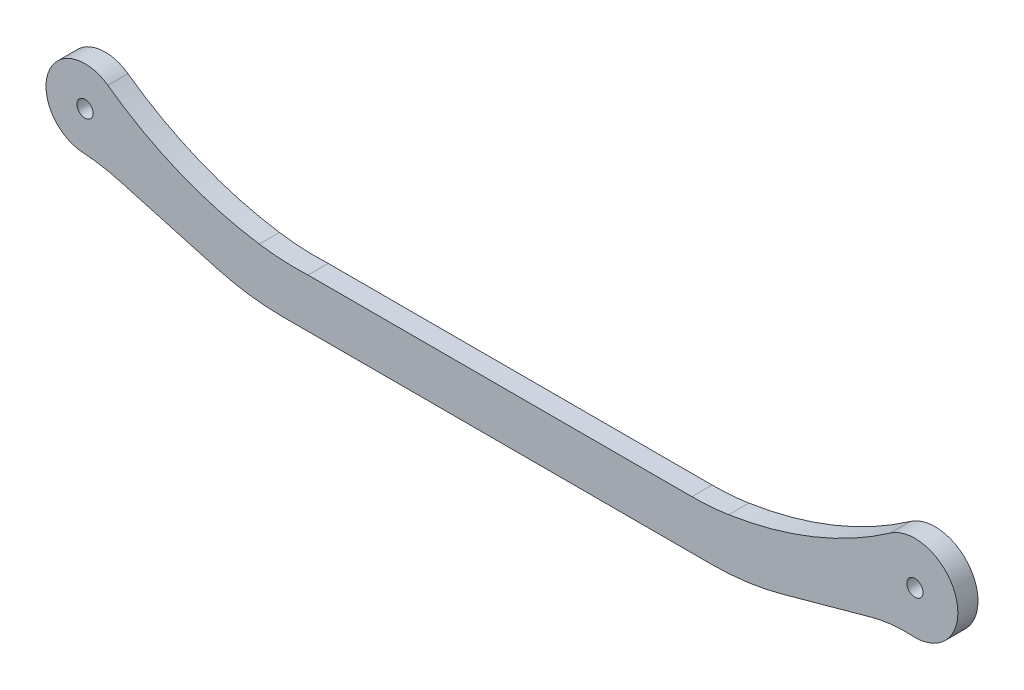
ISO-10303-21;
HEADER;
FILE_DESCRIPTION(('STEP AP214'),'2;1');
FILE_NAME('part.step','',(''),(''),'','','');
FILE_SCHEMA(('AUTOMOTIVE_DESIGN { 1 0 10303 214 1 1 1 1 }'));
ENDSEC;
DATA;
#1=APPLICATION_CONTEXT('core data for automotive mechanical design processes');
#2=APPLICATION_PROTOCOL_DEFINITION('international standard','automotive_design',2000,#1);
#3=PRODUCT_CONTEXT('',#1,'mechanical');
#4=PRODUCT('Part','Part','',(#3));
#5=PRODUCT_RELATED_PRODUCT_CATEGORY('part','',(#4));
#6=PRODUCT_DEFINITION_FORMATION('','',#4);
#7=PRODUCT_DEFINITION_CONTEXT('part definition',#1,'design');
#8=PRODUCT_DEFINITION('design','',#6,#7);
#9=PRODUCT_DEFINITION_SHAPE('','',#8);
#10=(LENGTH_UNIT() NAMED_UNIT(*) SI_UNIT(.MILLI.,.METRE.));
#11=(NAMED_UNIT(*) PLANE_ANGLE_UNIT() SI_UNIT($,.RADIAN.));
#12=(NAMED_UNIT(*) SI_UNIT($,.STERADIAN.) SOLID_ANGLE_UNIT());
#13=UNCERTAINTY_MEASURE_WITH_UNIT(LENGTH_MEASURE(1.E-05),#10,'distance_accuracy_value','');
#14=(GEOMETRIC_REPRESENTATION_CONTEXT(3) GLOBAL_UNCERTAINTY_ASSIGNED_CONTEXT((#13)) GLOBAL_UNIT_ASSIGNED_CONTEXT((#10,
#11,#12)) REPRESENTATION_CONTEXT('',''));
#15=CARTESIAN_POINT('',(0.,0.,0.));
#16=DIRECTION('',(0.,0.,1.));
#17=DIRECTION('',(1.,0.,0.));
#18=AXIS2_PLACEMENT_3D('',#15,#16,#17);
#19=CARTESIAN_POINT('',(-62.7409689195023,65.5556216099531,6.2));
#20=DIRECTION('',(0.,0.,-1.));
#21=DIRECTION('',(-1.,0.,0.));
#22=AXIS2_PLACEMENT_3D('',#19,#20,#21);
#23=CYLINDRICAL_SURFACE('',#22,75.648177805702);
#24=CARTESIAN_POINT('',(-62.7409689195023,65.5556216099531,0.));
#25=DIRECTION('',(0.,0.,1.));
#26=DIRECTION('',(1.,0.,0.));
#27=AXIS2_PLACEMENT_3D('',#24,#25,#26);
#28=CIRCLE('',#27,75.648177805702);
#29=CARTESIAN_POINT('',(-74.,-9.24999999999999,0.));
#30=VERTEX_POINT('',#29);
#31=CARTESIAN_POINT('',(-59.,-10.,0.));
#32=VERTEX_POINT('',#31);
#33=EDGE_CURVE('E172',#30,#32,#28,.T.);
#34=ORIENTED_EDGE('',*,*,#33,.F.);
#35=DIRECTION('',(0.,0.,-1.));
#36=VECTOR('',#35,1.);
#37=CARTESIAN_POINT('',(-74.,-9.24999999999999,6.2));
#38=LINE('',#37,#36);
#39=CARTESIAN_POINT('',(-74.,-9.24999999999999,6.2));
#40=VERTEX_POINT('',#39);
#41=EDGE_CURVE('E11',#40,#30,#38,.T.);
#42=ORIENTED_EDGE('',*,*,#41,.F.);
#43=CARTESIAN_POINT('',(-62.7409689195023,65.5556216099531,6.2));
#44=DIRECTION('',(0.,0.,1.));
#45=DIRECTION('',(1.,0.,0.));
#46=AXIS2_PLACEMENT_3D('',#43,#44,#45);
#47=CIRCLE('',#46,75.648177805702);
#48=CARTESIAN_POINT('',(-59.,-10.,6.2));
#49=VERTEX_POINT('',#48);
#50=EDGE_CURVE('E210',#40,#49,#47,.T.);
#51=ORIENTED_EDGE('',*,*,#50,.T.);
#52=DIRECTION('',(0.,0.,-1.));
#53=VECTOR('',#52,1.);
#54=CARTESIAN_POINT('',(-59.,-10.,6.2));
#55=LINE('',#54,#53);
#56=EDGE_CURVE('E105',#49,#32,#55,.T.);
#57=ORIENTED_EDGE('',*,*,#56,.T.);
#58=EDGE_LOOP('',(#34,#42,#51,#57));
#59=FACE_BOUND('',#58,.T.);
#60=ADVANCED_FACE('F37',(#59),#23,.F.);
#61=CARTESIAN_POINT('',(-58.1155378204654,96.2872401749656,6.2));
#62=DIRECTION('',(0.,0.,-1.));
#63=DIRECTION('',(-1.,0.,0.));
#64=AXIS2_PLACEMENT_3D('',#61,#62,#63);
#65=CYLINDRICAL_SURFACE('',#64,106.725935004016);
#66=CARTESIAN_POINT('',(-58.1155378204654,96.2872401749656,0.));
#67=DIRECTION('',(0.,0.,1.));
#68=DIRECTION('',(1.,0.,0.));
#69=AXIS2_PLACEMENT_3D('',#66,#67,#68);
#70=CIRCLE('',#69,106.725935004016);
#71=CARTESIAN_POINT('',(-120.554503776317,9.73205123261821,0.));
#72=VERTEX_POINT('',#71);
#73=EDGE_CURVE('E175',#72,#30,#70,.T.);
#74=ORIENTED_EDGE('',*,*,#73,.F.);
#75=DIRECTION('',(0.,0.,-1.));
#76=VECTOR('',#75,1.);
#77=CARTESIAN_POINT('',(-120.554503776317,9.73205123261821,6.2));
#78=LINE('',#77,#76);
#79=CARTESIAN_POINT('',(-120.554503776317,9.73205123261821,6.2));
#80=VERTEX_POINT('',#79);
#81=EDGE_CURVE('E45',#80,#72,#78,.T.);
#82=ORIENTED_EDGE('',*,*,#81,.F.);
#83=CARTESIAN_POINT('',(-58.1155378204654,96.2872401749656,6.2));
#84=DIRECTION('',(0.,0.,1.));
#85=DIRECTION('',(1.,0.,0.));
#86=AXIS2_PLACEMENT_3D('',#83,#84,#85);
#87=CIRCLE('',#86,106.725935004016);
#88=EDGE_CURVE('E251',#80,#40,#87,.T.);
#89=ORIENTED_EDGE('',*,*,#88,.T.);
#90=ORIENTED_EDGE('',*,*,#41,.T.);
#91=EDGE_LOOP('',(#74,#82,#89,#90));
#92=FACE_BOUND('',#91,.T.);
#93=ADVANCED_FACE('F250',(#92),#65,.F.);
#94=CARTESIAN_POINT('',(-127.574986580633,0.,6.2));
#95=DIRECTION('',(0.,0.,-1.));
#96=DIRECTION('',(-1.,0.,0.));
#97=AXIS2_PLACEMENT_3D('',#94,#95,#96);
#98=CYLINDRICAL_SURFACE('',#97,12.);
#99=CARTESIAN_POINT('',(-127.574986580633,0.,0.));
#100=DIRECTION('',(0.,0.,1.));
#101=DIRECTION('',(1.,0.,0.));
#102=AXIS2_PLACEMENT_3D('',#99,#100,#101);
#103=CIRCLE('',#102,12.);
#104=CARTESIAN_POINT('',(-128.349445962785,-11.9749827835115,0.));
#105=VERTEX_POINT('',#104);
#106=EDGE_CURVE('E178',#72,#105,#103,.T.);
#107=ORIENTED_EDGE('',*,*,#106,.T.);
#108=DIRECTION('',(0.,0.,-1.));
#109=VECTOR('',#108,1.);
#110=CARTESIAN_POINT('',(-128.349445962785,-11.9749827835115,6.2));
#111=LINE('',#110,#109);
#112=CARTESIAN_POINT('',(-128.349445962785,-11.9749827835115,6.2));
#113=VERTEX_POINT('',#112);
#114=EDGE_CURVE('E234',#113,#105,#111,.T.);
#115=ORIENTED_EDGE('',*,*,#114,.F.);
#116=CARTESIAN_POINT('',(-127.574986580633,0.,6.2));
#117=DIRECTION('',(0.,0.,1.));
#118=DIRECTION('',(1.,0.,0.));
#119=AXIS2_PLACEMENT_3D('',#116,#117,#118);
#120=CIRCLE('',#119,12.);
#121=EDGE_CURVE('E240',#80,#113,#120,.T.);
#122=ORIENTED_EDGE('',*,*,#121,.F.);
#123=ORIENTED_EDGE('',*,*,#81,.T.);
#124=EDGE_LOOP('',(#107,#115,#122,#123));
#125=FACE_BOUND('',#124,.T.);
#126=ADVANCED_FACE('F238',(#125),#98,.T.);
#127=CARTESIAN_POINT('',(-131.963589746161,-67.8582357732319,6.2));
#128=DIRECTION('',(0.,0.,-1.));
#129=DIRECTION('',(-1.,0.,0.));
#130=AXIS2_PLACEMENT_3D('',#127,#128,#129);
#131=CYLINDRICAL_SURFACE('',#130,56.);
#132=CARTESIAN_POINT('',(-131.963589746161,-67.8582357732319,0.));
#133=DIRECTION('',(0.,0.,1.));
#134=DIRECTION('',(1.,0.,0.));
#135=AXIS2_PLACEMENT_3D('',#132,#133,#134);
#136=CIRCLE('',#135,56.);
#137=CARTESIAN_POINT('',(-116.938372424752,-13.9115691065652,0.));
#138=VERTEX_POINT('',#137);
#139=EDGE_CURVE('E181',#138,#105,#136,.T.);
#140=ORIENTED_EDGE('',*,*,#139,.F.);
#141=DIRECTION('',(0.,0.,-1.));
#142=VECTOR('',#141,1.);
#143=CARTESIAN_POINT('',(-116.938372424752,-13.9115691065652,6.2));
#144=LINE('',#143,#142);
#145=CARTESIAN_POINT('',(-116.938372424752,-13.9115691065652,6.2));
#146=VERTEX_POINT('',#145);
#147=EDGE_CURVE('E232',#146,#138,#144,.T.);
#148=ORIENTED_EDGE('',*,*,#147,.F.);
#149=CARTESIAN_POINT('',(-131.963589746161,-67.8582357732319,6.2));
#150=DIRECTION('',(0.,0.,1.));
#151=DIRECTION('',(1.,0.,0.));
#152=AXIS2_PLACEMENT_3D('',#149,#150,#151);
#153=CIRCLE('',#152,56.);
#154=EDGE_CURVE('E257',#146,#113,#153,.T.);
#155=ORIENTED_EDGE('',*,*,#154,.T.);
#156=ORIENTED_EDGE('',*,*,#114,.T.);
#157=EDGE_LOOP('',(#140,#148,#155,#156));
#158=FACE_BOUND('',#157,.T.);
#159=ADVANCED_FACE('F305',(#158),#131,.F.);
#160=CARTESIAN_POINT('',(-12.0139799810112,-43.1350947884231,6.2));
#161=DIRECTION('',(0.26830745216801,0.963333333333333,0.));
#162=DIRECTION('',(-0.963333333333333,0.26830745216801,0.));
#163=AXIS2_PLACEMENT_3D('',#160,#161,#162);
#164=PLANE('',#163);
#165=DIRECTION('',(0.963333333333333,-0.26830745216801,0.));
#166=VECTOR('',#165,1.);
#167=CARTESIAN_POINT('',(-12.0139799810112,-43.1350947884231,0.));
#168=LINE('',#167,#166);
#169=CARTESIAN_POINT('',(-87.,-22.25,0.));
#170=VERTEX_POINT('',#169);
#171=EDGE_CURVE('E184',#138,#170,#168,.T.);
#172=ORIENTED_EDGE('',*,*,#171,.T.);
#173=DIRECTION('',(0.,0.,-1.));
#174=VECTOR('',#173,1.);
#175=CARTESIAN_POINT('',(-87.,-22.25,6.2));
#176=LINE('',#175,#174);
#177=CARTESIAN_POINT('',(-87.,-22.25,6.2));
#178=VERTEX_POINT('',#177);
#179=EDGE_CURVE('E229',#178,#170,#176,.T.);
#180=ORIENTED_EDGE('',*,*,#179,.F.);
#181=DIRECTION('',(0.963333333333333,-0.26830745216801,0.));
#182=VECTOR('',#181,1.);
#183=CARTESIAN_POINT('',(-12.0139799810112,-43.1350947884231,6.2));
#184=LINE('',#183,#182);
#185=EDGE_CURVE('E260',#146,#178,#184,.T.);
#186=ORIENTED_EDGE('',*,*,#185,.F.);
#187=ORIENTED_EDGE('',*,*,#147,.T.);
#188=EDGE_LOOP('',(#172,#180,#186,#187));
#189=FACE_BOUND('',#188,.T.);
#190=ADVANCED_FACE('F302',(#189),#164,.F.);
#191=CARTESIAN_POINT('',(-66.8769410873992,50.,6.2));
#192=DIRECTION('',(0.,0.,-1.));
#193=DIRECTION('',(-1.,0.,0.));
#194=AXIS2_PLACEMENT_3D('',#191,#192,#193);
#195=CYLINDRICAL_SURFACE('',#194,75.);
#196=CARTESIAN_POINT('',(-66.8769410873992,50.,0.));
#197=DIRECTION('',(0.,0.,1.));
#198=DIRECTION('',(1.,0.,0.));
#199=AXIS2_PLACEMENT_3D('',#196,#197,#198);
#200=CIRCLE('',#199,75.);
#201=CARTESIAN_POINT('',(-66.8769410873992,-25.,0.));
#202=VERTEX_POINT('',#201);
#203=EDGE_CURVE('E186',#170,#202,#200,.T.);
#204=ORIENTED_EDGE('',*,*,#203,.T.);
#205=DIRECTION('',(0.,0.,-1.));
#206=VECTOR('',#205,1.);
#207=CARTESIAN_POINT('',(-66.8769410873992,-25.,6.2));
#208=LINE('',#207,#206);
#209=CARTESIAN_POINT('',(-66.8769410873992,-25.,6.2));
#210=VERTEX_POINT('',#209);
#211=EDGE_CURVE('E226',#210,#202,#208,.T.);
#212=ORIENTED_EDGE('',*,*,#211,.F.);
#213=CARTESIAN_POINT('',(-66.8769410873992,50.,6.2));
#214=DIRECTION('',(0.,0.,1.));
#215=DIRECTION('',(1.,0.,0.));
#216=AXIS2_PLACEMENT_3D('',#213,#214,#215);
#217=CIRCLE('',#216,75.);
#218=EDGE_CURVE('E262',#178,#210,#217,.T.);
#219=ORIENTED_EDGE('',*,*,#218,.F.);
#220=ORIENTED_EDGE('',*,*,#179,.T.);
#221=EDGE_LOOP('',(#204,#212,#219,#220));
#222=FACE_BOUND('',#221,.T.);
#223=ADVANCED_FACE('F297',(#222),#195,.T.);
#224=CARTESIAN_POINT('',(0.,-25.,6.2));
#225=DIRECTION('',(0.,1.,0.));
#226=DIRECTION('',(-1.,0.,0.));
#227=AXIS2_PLACEMENT_3D('',#224,#225,#226);
#228=PLANE('',#227);
#229=DIRECTION('',(1.,0.,0.));
#230=VECTOR('',#229,1.);
#231=CARTESIAN_POINT('',(0.,-25.,0.));
#232=LINE('',#231,#230);
#233=CARTESIAN_POINT('',(65.,-25.,0.));
#234=VERTEX_POINT('',#233);
#235=EDGE_CURVE('E188',#202,#234,#232,.T.);
#236=ORIENTED_EDGE('',*,*,#235,.T.);
#237=DIRECTION('',(0.,0.,-1.));
#238=VECTOR('',#237,1.);
#239=CARTESIAN_POINT('',(65.,-25.,6.2));
#240=LINE('',#239,#238);
#241=CARTESIAN_POINT('',(65.,-25.,6.2));
#242=VERTEX_POINT('',#241);
#243=EDGE_CURVE('E223',#242,#234,#240,.T.);
#244=ORIENTED_EDGE('',*,*,#243,.F.);
#245=DIRECTION('',(1.,0.,0.));
#246=VECTOR('',#245,1.);
#247=CARTESIAN_POINT('',(0.,-25.,6.2));
#248=LINE('',#247,#246);
#249=EDGE_CURVE('E264',#210,#242,#248,.T.);
#250=ORIENTED_EDGE('',*,*,#249,.F.);
#251=ORIENTED_EDGE('',*,*,#211,.T.);
#252=EDGE_LOOP('',(#236,#244,#250,#251));
#253=FACE_BOUND('',#252,.T.);
#254=ADVANCED_FACE('F293',(#253),#228,.F.);
#255=CARTESIAN_POINT('',(65.,57.0047350426019,6.2));
#256=DIRECTION('',(0.,0.,-1.));
#257=DIRECTION('',(-1.,0.,0.));
#258=AXIS2_PLACEMENT_3D('',#255,#256,#257);
#259=CYLINDRICAL_SURFACE('',#258,82.0047350426019);
#260=CARTESIAN_POINT('',(65.,57.0047350426019,0.));
#261=DIRECTION('',(0.,0.,1.));
#262=DIRECTION('',(1.,0.,0.));
#263=AXIS2_PLACEMENT_3D('',#260,#261,#262);
#264=CIRCLE('',#263,82.0047350426019);
#265=CARTESIAN_POINT('',(86.7564749329506,-22.0612650326468,0.));
#266=VERTEX_POINT('',#265);
#267=EDGE_CURVE('E190',#234,#266,#264,.T.);
#268=ORIENTED_EDGE('',*,*,#267,.T.);
#269=DIRECTION('',(0.,0.,-1.));
#270=VECTOR('',#269,1.);
#271=CARTESIAN_POINT('',(86.7564749329506,-22.0612650326468,6.2));
#272=LINE('',#271,#270);
#273=CARTESIAN_POINT('',(86.7564749329506,-22.0612650326468,6.2));
#274=VERTEX_POINT('',#273);
#275=EDGE_CURVE('E220',#274,#266,#272,.T.);
#276=ORIENTED_EDGE('',*,*,#275,.F.);
#277=CARTESIAN_POINT('',(65.,57.0047350426019,6.2));
#278=DIRECTION('',(0.,0.,1.));
#279=DIRECTION('',(1.,0.,0.));
#280=AXIS2_PLACEMENT_3D('',#277,#278,#279);
#281=CIRCLE('',#280,82.0047350426019);
#282=EDGE_CURVE('E266',#242,#274,#281,.T.);
#283=ORIENTED_EDGE('',*,*,#282,.F.);
#284=ORIENTED_EDGE('',*,*,#243,.T.);
#285=EDGE_LOOP('',(#268,#276,#283,#284));
#286=FACE_BOUND('',#285,.T.);
#287=ADVANCED_FACE('F289',(#286),#259,.T.);
#288=CARTESIAN_POINT('',(11.7498931542495,-42.7007158044265,6.2));
#289=DIRECTION('',(-0.265307545005151,0.964163838029274,0.));
#290=DIRECTION('',(-0.964163838029274,-0.265307545005152,0.));
#291=AXIS2_PLACEMENT_3D('',#288,#289,#290);
#292=PLANE('',#291);
#293=DIRECTION('',(0.964163838029274,0.265307545005152,0.));
#294=VECTOR('',#293,1.);
#295=CARTESIAN_POINT('',(11.7498931542495,-42.7007158044265,0.));
#296=LINE('',#295,#294);
#297=CARTESIAN_POINT('',(114.235144316785,-14.5,0.));
#298=VERTEX_POINT('',#297);
#299=EDGE_CURVE('E192',#266,#298,#296,.T.);
#300=ORIENTED_EDGE('',*,*,#299,.T.);
#301=DIRECTION('',(0.,0.,-1.));
#302=VECTOR('',#301,1.);
#303=CARTESIAN_POINT('',(114.235144316785,-14.5,6.2));
#304=LINE('',#303,#302);
#305=CARTESIAN_POINT('',(114.235144316785,-14.5,6.2));
#306=VERTEX_POINT('',#305);
#307=EDGE_CURVE('E217',#306,#298,#304,.T.);
#308=ORIENTED_EDGE('',*,*,#307,.F.);
#309=DIRECTION('',(0.964163838029274,0.265307545005152,0.));
#310=VECTOR('',#309,1.);
#311=CARTESIAN_POINT('',(11.7498931542495,-42.7007158044265,6.2));
#312=LINE('',#311,#310);
#313=EDGE_CURVE('E268',#274,#306,#312,.T.);
#314=ORIENTED_EDGE('',*,*,#313,.F.);
#315=ORIENTED_EDGE('',*,*,#275,.T.);
#316=EDGE_LOOP('',(#300,#308,#314,#315));
#317=FACE_BOUND('',#316,.T.);
#318=ADVANCED_FACE('F285',(#317),#292,.F.);
#319=CARTESIAN_POINT('',(124.52328985269,-51.888525403262,6.2));
#320=DIRECTION('',(0.,0.,-1.));
#321=DIRECTION('',(-1.,0.,0.));
#322=AXIS2_PLACEMENT_3D('',#319,#320,#321);
#323=CYLINDRICAL_SURFACE('',#322,38.7781867858509);
#324=CARTESIAN_POINT('',(124.52328985269,-51.888525403262,0.));
#325=DIRECTION('',(0.,0.,1.));
#326=DIRECTION('',(1.,0.,0.));
#327=AXIS2_PLACEMENT_3D('',#324,#325,#326);
#328=CIRCLE('',#327,38.7781867858509);
#329=CARTESIAN_POINT('',(126.8,-13.177230393879,0.));
#330=VERTEX_POINT('',#329);
#331=EDGE_CURVE('E194',#298,#330,#328,.F.);
#332=ORIENTED_EDGE('',*,*,#331,.T.);
#333=DIRECTION('',(0.,0.,-1.));
#334=VECTOR('',#333,1.);
#335=CARTESIAN_POINT('',(126.8,-13.177230393879,6.2));
#336=LINE('',#335,#334);
#337=CARTESIAN_POINT('',(126.8,-13.177230393879,6.2));
#338=VERTEX_POINT('',#337);
#339=EDGE_CURVE('E214',#338,#330,#336,.T.);
#340=ORIENTED_EDGE('',*,*,#339,.F.);
#341=CARTESIAN_POINT('',(124.52328985269,-51.888525403262,6.2));
#342=DIRECTION('',(0.,0.,1.));
#343=DIRECTION('',(1.,0.,0.));
#344=AXIS2_PLACEMENT_3D('',#341,#342,#343);
#345=CIRCLE('',#344,38.7781867858509);
#346=EDGE_CURVE('E270',#306,#338,#345,.F.);
#347=ORIENTED_EDGE('',*,*,#346,.F.);
#348=ORIENTED_EDGE('',*,*,#307,.T.);
#349=EDGE_LOOP('',(#332,#340,#347,#348));
#350=FACE_BOUND('',#349,.T.);
#351=ADVANCED_FACE('F276',(#350),#323,.F.);
#352=CARTESIAN_POINT('',(127.574986580633,0.,6.2));
#353=DIRECTION('',(0.,0.,-1.));
#354=DIRECTION('',(-1.,0.,0.));
#355=AXIS2_PLACEMENT_3D('',#352,#353,#354);
#356=CYLINDRICAL_SURFACE('',#355,13.2000001914215);
#357=CARTESIAN_POINT('',(127.574986580633,0.,0.));
#358=DIRECTION('',(0.,0.,1.));
#359=DIRECTION('',(1.,0.,0.));
#360=AXIS2_PLACEMENT_3D('',#357,#358,#359);
#361=CIRCLE('',#360,13.2000001914215);
#362=CARTESIAN_POINT('',(120.,10.8101611161332,0.));
#363=VERTEX_POINT('',#362);
#364=EDGE_CURVE('E196',#330,#363,#361,.T.);
#365=ORIENTED_EDGE('',*,*,#364,.T.);
#366=DIRECTION('',(0.,0.,-1.));
#367=VECTOR('',#366,1.);
#368=CARTESIAN_POINT('',(120.,10.8101611161332,6.2));
#369=LINE('',#368,#367);
#370=CARTESIAN_POINT('',(120.,10.8101611161332,6.2));
#371=VERTEX_POINT('',#370);
#372=EDGE_CURVE('E152',#371,#363,#369,.T.);
#373=ORIENTED_EDGE('',*,*,#372,.F.);
#374=CARTESIAN_POINT('',(127.574986580633,0.,6.2));
#375=DIRECTION('',(0.,0.,1.));
#376=DIRECTION('',(1.,0.,0.));
#377=AXIS2_PLACEMENT_3D('',#374,#375,#376);
#378=CIRCLE('',#377,13.2000001914215);
#379=EDGE_CURVE('E158',#338,#371,#378,.T.);
#380=ORIENTED_EDGE('',*,*,#379,.F.);
#381=ORIENTED_EDGE('',*,*,#339,.T.);
#382=EDGE_LOOP('',(#365,#373,#380,#381));
#383=FACE_BOUND('',#382,.T.);
#384=ADVANCED_FACE('F280',(#383),#356,.T.);
#385=CARTESIAN_POINT('',(52.4541757053268,107.203895359091,6.2));
#386=DIRECTION('',(0.,0.,-1.));
#387=DIRECTION('',(-1.,0.,0.));
#388=AXIS2_PLACEMENT_3D('',#385,#386,#387);
#389=CYLINDRICAL_SURFACE('',#388,117.703824835681);
#390=CARTESIAN_POINT('',(52.4541757053268,107.203895359091,0.));
#391=DIRECTION('',(0.,0.,1.));
#392=DIRECTION('',(1.,0.,0.));
#393=AXIS2_PLACEMENT_3D('',#390,#391,#392);
#394=CIRCLE('',#393,117.703824835681);
#395=CARTESIAN_POINT('',(70.3288900519656,-9.1347696150903,0.));
#396=VERTEX_POINT('',#395);
#397=EDGE_CURVE('E147',#396,#363,#394,.T.);
#398=ORIENTED_EDGE('',*,*,#397,.F.);
#399=DIRECTION('',(0.,0.,-1.));
#400=VECTOR('',#399,1.);
#401=CARTESIAN_POINT('',(70.3288900519656,-9.1347696150903,6.2));
#402=LINE('',#401,#400);
#403=CARTESIAN_POINT('',(70.3288900519656,-9.1347696150903,6.2));
#404=VERTEX_POINT('',#403);
#405=EDGE_CURVE('E142',#404,#396,#402,.T.);
#406=ORIENTED_EDGE('',*,*,#405,.F.);
#407=CARTESIAN_POINT('',(52.4541757053268,107.203895359091,6.2));
#408=DIRECTION('',(0.,0.,1.));
#409=DIRECTION('',(1.,0.,0.));
#410=AXIS2_PLACEMENT_3D('',#407,#408,#409);
#411=CIRCLE('',#410,117.703824835681);
#412=EDGE_CURVE('E145',#404,#371,#411,.T.);
#413=ORIENTED_EDGE('',*,*,#412,.T.);
#414=ORIENTED_EDGE('',*,*,#372,.T.);
#415=EDGE_LOOP('',(#398,#406,#413,#414));
#416=FACE_BOUND('',#415,.T.);
#417=ADVANCED_FACE('F144',(#416),#389,.F.);
#418=CARTESIAN_POINT('',(59.,64.6,6.2));
#419=DIRECTION('',(0.,0.,-1.));
#420=DIRECTION('',(-1.,0.,0.));
#421=AXIS2_PLACEMENT_3D('',#418,#419,#420);
#422=CYLINDRICAL_SURFACE('',#421,74.5999999999998);
#423=CARTESIAN_POINT('',(59.,64.6,0.));
#424=DIRECTION('',(0.,0.,1.));
#425=DIRECTION('',(1.,0.,0.));
#426=AXIS2_PLACEMENT_3D('',#423,#424,#425);
#427=CIRCLE('',#426,74.5999999999998);
#428=CARTESIAN_POINT('',(59.,-9.99999999999999,0.));
#429=VERTEX_POINT('',#428);
#430=EDGE_CURVE('E200',#429,#396,#427,.T.);
#431=ORIENTED_EDGE('',*,*,#430,.F.);
#432=DIRECTION('',(0.,0.,-1.));
#433=VECTOR('',#432,1.);
#434=CARTESIAN_POINT('',(59.,-9.99999999999999,6.2));
#435=LINE('',#434,#433);
#436=CARTESIAN_POINT('',(59.,-9.99999999999999,6.2));
#437=VERTEX_POINT('',#436);
#438=EDGE_CURVE('E98',#437,#429,#435,.T.);
#439=ORIENTED_EDGE('',*,*,#438,.F.);
#440=CARTESIAN_POINT('',(59.,64.6,6.2));
#441=DIRECTION('',(0.,0.,1.));
#442=DIRECTION('',(1.,0.,0.));
#443=AXIS2_PLACEMENT_3D('',#440,#441,#442);
#444=CIRCLE('',#443,74.5999999999998);
#445=EDGE_CURVE('E156',#437,#404,#444,.T.);
#446=ORIENTED_EDGE('',*,*,#445,.T.);
#447=ORIENTED_EDGE('',*,*,#405,.T.);
#448=EDGE_LOOP('',(#431,#439,#446,#447));
#449=FACE_BOUND('',#448,.T.);
#450=ADVANCED_FACE('F161',(#449),#422,.F.);
#451=CARTESIAN_POINT('',(127.574986580633,0.,6.2));
#452=DIRECTION('',(0.,0.,-1.));
#453=DIRECTION('',(-1.,0.,0.));
#454=AXIS2_PLACEMENT_3D('',#451,#452,#453);
#455=CYLINDRICAL_SURFACE('',#454,2.5);
#456=CARTESIAN_POINT('',(127.574986580633,0.,6.2));
#457=DIRECTION('',(0.,0.,1.));
#458=DIRECTION('',(1.,0.,0.));
#459=AXIS2_PLACEMENT_3D('',#456,#457,#458);
#460=CIRCLE('',#459,2.5);
#461=CARTESIAN_POINT('',(125.074986580633,0.,6.2));
#462=VERTEX_POINT('',#461);
#463=EDGE_CURVE('E163',#462,#462,#460,.T.);
#464=CARTESIAN_POINT('',(127.574986580633,0.,0.));
#465=DIRECTION('',(0.,0.,1.));
#466=DIRECTION('',(1.,0.,0.));
#467=AXIS2_PLACEMENT_3D('',#464,#465,#466);
#468=CIRCLE('',#467,2.5);
#469=CARTESIAN_POINT('',(125.074986580633,0.,0.));
#470=VERTEX_POINT('',#469);
#471=EDGE_CURVE('E204',#470,#470,#468,.T.);
#472=CARTESIAN_POINT('',(125.074986580633,0.,6.2));
#473=CARTESIAN_POINT('',(125.074986580633,0.,6.13541666666667));
#474=CARTESIAN_POINT('',(125.074986580633,0.,6.07083333333333));
#475=CARTESIAN_POINT('',(125.074986580633,0.,5.94166666666667));
#476=CARTESIAN_POINT('',(125.074986580633,0.,5.87708333333333));
#477=CARTESIAN_POINT('',(125.074986580633,0.,5.74791666666667));
#478=CARTESIAN_POINT('',(125.074986580633,0.,5.68333333333333));
#479=CARTESIAN_POINT('',(125.074986580633,0.,5.55416666666667));
#480=CARTESIAN_POINT('',(125.074986580633,0.,5.48958333333333));
#481=CARTESIAN_POINT('',(125.074986580633,0.,5.36041666666667));
#482=CARTESIAN_POINT('',(125.074986580633,0.,5.29583333333333));
#483=CARTESIAN_POINT('',(125.074986580633,0.,5.16666666666667));
#484=CARTESIAN_POINT('',(125.074986580633,0.,5.10208333333333));
#485=CARTESIAN_POINT('',(125.074986580633,0.,4.97291666666667));
#486=CARTESIAN_POINT('',(125.074986580633,0.,4.90833333333333));
#487=CARTESIAN_POINT('',(125.074986580633,0.,4.77916666666667));
#488=CARTESIAN_POINT('',(125.074986580633,0.,4.71458333333333));
#489=CARTESIAN_POINT('',(125.074986580633,0.,4.58541666666667));
#490=CARTESIAN_POINT('',(125.074986580633,0.,4.52083333333333));
#491=CARTESIAN_POINT('',(125.074986580633,0.,4.39166666666667));
#492=CARTESIAN_POINT('',(125.074986580633,0.,4.32708333333333));
#493=CARTESIAN_POINT('',(125.074986580633,0.,4.19791666666667));
#494=CARTESIAN_POINT('',(125.074986580633,0.,4.13333333333333));
#495=CARTESIAN_POINT('',(125.074986580633,0.,4.00416666666667));
#496=CARTESIAN_POINT('',(125.074986580633,0.,3.93958333333333));
#497=CARTESIAN_POINT('',(125.074986580633,0.,3.81041666666667));
#498=CARTESIAN_POINT('',(125.074986580633,0.,3.74583333333333));
#499=CARTESIAN_POINT('',(125.074986580633,0.,3.61666666666667));
#500=CARTESIAN_POINT('',(125.074986580633,0.,3.55208333333333));
#501=CARTESIAN_POINT('',(125.074986580633,0.,3.42291666666667));
#502=CARTESIAN_POINT('',(125.074986580633,0.,3.35833333333333));
#503=CARTESIAN_POINT('',(125.074986580633,0.,3.22916666666667));
#504=CARTESIAN_POINT('',(125.074986580633,0.,3.16458333333333));
#505=CARTESIAN_POINT('',(125.074986580633,0.,3.03541666666667));
#506=CARTESIAN_POINT('',(125.074986580633,0.,2.97083333333333));
#507=CARTESIAN_POINT('',(125.074986580633,0.,2.84166666666667));
#508=CARTESIAN_POINT('',(125.074986580633,0.,2.77708333333333));
#509=CARTESIAN_POINT('',(125.074986580633,0.,2.64791666666667));
#510=CARTESIAN_POINT('',(125.074986580633,0.,2.58333333333333));
#511=CARTESIAN_POINT('',(125.074986580633,0.,2.45416666666667));
#512=CARTESIAN_POINT('',(125.074986580633,0.,2.38958333333333));
#513=CARTESIAN_POINT('',(125.074986580633,0.,2.26041666666667));
#514=CARTESIAN_POINT('',(125.074986580633,0.,2.19583333333333));
#515=CARTESIAN_POINT('',(125.074986580633,0.,2.06666666666667));
#516=CARTESIAN_POINT('',(125.074986580633,0.,2.00208333333333));
#517=CARTESIAN_POINT('',(125.074986580633,0.,1.87291666666667));
#518=CARTESIAN_POINT('',(125.074986580633,0.,1.80833333333333));
#519=CARTESIAN_POINT('',(125.074986580633,0.,1.67916666666667));
#520=CARTESIAN_POINT('',(125.074986580633,0.,1.61458333333333));
#521=CARTESIAN_POINT('',(125.074986580633,0.,1.48541666666667));
#522=CARTESIAN_POINT('',(125.074986580633,0.,1.42083333333333));
#523=CARTESIAN_POINT('',(125.074986580633,0.,1.29166666666667));
#524=CARTESIAN_POINT('',(125.074986580633,0.,1.22708333333333));
#525=CARTESIAN_POINT('',(125.074986580633,0.,1.09791666666667));
#526=CARTESIAN_POINT('',(125.074986580633,0.,1.03333333333333));
#527=CARTESIAN_POINT('',(125.074986580633,0.,0.904166666666667));
#528=CARTESIAN_POINT('',(125.074986580633,0.,0.839583333333333));
#529=CARTESIAN_POINT('',(125.074986580633,0.,0.710416666666666));
#530=CARTESIAN_POINT('',(125.074986580633,0.,0.645833333333333));
#531=CARTESIAN_POINT('',(125.074986580633,0.,0.516666666666667));
#532=CARTESIAN_POINT('',(125.074986580633,0.,0.452083333333333));
#533=CARTESIAN_POINT('',(125.074986580633,0.,0.322916666666667));
#534=CARTESIAN_POINT('',(125.074986580633,0.,0.258333333333334));
#535=CARTESIAN_POINT('',(125.074986580633,0.,0.129166666666667));
#536=CARTESIAN_POINT('',(125.074986580633,0.,0.0645833333333335));
#537=CARTESIAN_POINT('',(125.074986580633,0.,0.));
#538=B_SPLINE_CURVE_WITH_KNOTS('',3,(#472,#473,#474,#475,#476,#477,#478,#479,#480,#481,#482,
#483,#484,#485,#486,#487,#488,#489,#490,#491,#492,#493,#494,#495,#496,#497,#498,#499,#500,#501,
#502,#503,#504,#505,#506,#507,#508,#509,#510,#511,#512,#513,#514,#515,#516,#517,#518,#519,#520,
#521,#522,#523,#524,#525,#526,#527,#528,#529,#530,#531,#532,#533,#534,#535,#536,#537),
.UNSPECIFIED.,.F.,.F.,(4,2,2,2,2,2,2,2,2,2,2,2,2,2,2,2,2,2,2,2,2,2,2,2,2,2,2,2,2,2,2,2,4),(0.,
0.193749999999999,0.3875,0.581249999999999,0.775,0.968749999999999,1.1625,1.35625,1.55,1.74375,
1.9375,2.13125,2.325,2.51875,2.7125,2.90625,3.1,3.29375,3.4875,3.68125,3.875,4.06875,4.2625,
4.45625,4.65,4.84375,5.0375,5.23125,5.425,5.61875,5.8125,6.00625,6.2),.UNSPECIFIED.);
#539=EDGE_CURVE('BSEAM399',#462,#470,#538,.T.);
#540=ORIENTED_EDGE('',*,*,#463,.T.);
#541=ORIENTED_EDGE('',*,*,#471,.F.);
#542=ORIENTED_EDGE('',*,*,#539,.T.);
#543=ORIENTED_EDGE('',*,*,#539,.F.);
#544=EDGE_LOOP('',(#540,#542,#541,#543));
#545=FACE_BOUND('',#544,.T.);
#546=ADVANCED_FACE('F399',(#545),#455,.F.);
#547=CARTESIAN_POINT('',(0.,-10.,6.2));
#548=DIRECTION('',(0.,-1.,0.));
#549=DIRECTION('',(1.,0.,0.));
#550=AXIS2_PLACEMENT_3D('',#547,#548,#549);
#551=PLANE('',#550);
#552=DIRECTION('',(-1.,0.,0.));
#553=VECTOR('',#552,1.);
#554=CARTESIAN_POINT('',(0.,-10.,0.));
#555=LINE('',#554,#553);
#556=EDGE_CURVE('E202',#429,#32,#555,.T.);
#557=ORIENTED_EDGE('',*,*,#556,.T.);
#558=ORIENTED_EDGE('',*,*,#56,.F.);
#559=DIRECTION('',(-1.,0.,0.));
#560=VECTOR('',#559,1.);
#561=CARTESIAN_POINT('',(0.,-10.,6.2));
#562=LINE('',#561,#560);
#563=EDGE_CURVE('E53',#437,#49,#562,.T.);
#564=ORIENTED_EDGE('',*,*,#563,.F.);
#565=ORIENTED_EDGE('',*,*,#438,.T.);
#566=EDGE_LOOP('',(#557,#558,#564,#565));
#567=FACE_BOUND('',#566,.T.);
#568=ADVANCED_FACE('F252',(#567),#551,.F.);
#569=CARTESIAN_POINT('',(-127.574986580633,0.,6.2));
#570=DIRECTION('',(0.,0.,-1.));
#571=DIRECTION('',(-1.,0.,0.));
#572=AXIS2_PLACEMENT_3D('',#569,#570,#571);
#573=CYLINDRICAL_SURFACE('',#572,2.5);
#574=CARTESIAN_POINT('',(-127.574986580633,0.,6.2));
#575=DIRECTION('',(0.,0.,1.));
#576=DIRECTION('',(1.,0.,0.));
#577=AXIS2_PLACEMENT_3D('',#574,#575,#576);
#578=CIRCLE('',#577,2.5);
#579=CARTESIAN_POINT('',(-130.074986580633,0.,6.2));
#580=VERTEX_POINT('',#579);
#581=EDGE_CURVE('E169',#580,#580,#578,.T.);
#582=CARTESIAN_POINT('',(-127.574986580633,0.,0.));
#583=DIRECTION('',(0.,0.,1.));
#584=DIRECTION('',(1.,0.,0.));
#585=AXIS2_PLACEMENT_3D('',#582,#583,#584);
#586=CIRCLE('',#585,2.5);
#587=CARTESIAN_POINT('',(-130.074986580633,0.,0.));
#588=VERTEX_POINT('',#587);
#589=EDGE_CURVE('E207',#588,#588,#586,.T.);
#590=CARTESIAN_POINT('',(-130.074986580633,0.,6.2));
#591=CARTESIAN_POINT('',(-130.074986580633,0.,6.13541666666667));
#592=CARTESIAN_POINT('',(-130.074986580633,0.,6.07083333333333));
#593=CARTESIAN_POINT('',(-130.074986580633,0.,5.94166666666667));
#594=CARTESIAN_POINT('',(-130.074986580633,0.,5.87708333333333));
#595=CARTESIAN_POINT('',(-130.074986580633,0.,5.74791666666667));
#596=CARTESIAN_POINT('',(-130.074986580633,0.,5.68333333333333));
#597=CARTESIAN_POINT('',(-130.074986580633,0.,5.55416666666667));
#598=CARTESIAN_POINT('',(-130.074986580633,0.,5.48958333333333));
#599=CARTESIAN_POINT('',(-130.074986580633,0.,5.36041666666667));
#600=CARTESIAN_POINT('',(-130.074986580633,0.,5.29583333333333));
#601=CARTESIAN_POINT('',(-130.074986580633,0.,5.16666666666667));
#602=CARTESIAN_POINT('',(-130.074986580633,0.,5.10208333333333));
#603=CARTESIAN_POINT('',(-130.074986580633,0.,4.97291666666667));
#604=CARTESIAN_POINT('',(-130.074986580633,0.,4.90833333333333));
#605=CARTESIAN_POINT('',(-130.074986580633,0.,4.77916666666667));
#606=CARTESIAN_POINT('',(-130.074986580633,0.,4.71458333333333));
#607=CARTESIAN_POINT('',(-130.074986580633,0.,4.58541666666667));
#608=CARTESIAN_POINT('',(-130.074986580633,0.,4.52083333333333));
#609=CARTESIAN_POINT('',(-130.074986580633,0.,4.39166666666667));
#610=CARTESIAN_POINT('',(-130.074986580633,0.,4.32708333333333));
#611=CARTESIAN_POINT('',(-130.074986580633,0.,4.19791666666667));
#612=CARTESIAN_POINT('',(-130.074986580633,0.,4.13333333333333));
#613=CARTESIAN_POINT('',(-130.074986580633,0.,4.00416666666667));
#614=CARTESIAN_POINT('',(-130.074986580633,0.,3.93958333333333));
#615=CARTESIAN_POINT('',(-130.074986580633,0.,3.81041666666667));
#616=CARTESIAN_POINT('',(-130.074986580633,0.,3.74583333333333));
#617=CARTESIAN_POINT('',(-130.074986580633,0.,3.61666666666667));
#618=CARTESIAN_POINT('',(-130.074986580633,0.,3.55208333333333));
#619=CARTESIAN_POINT('',(-130.074986580633,0.,3.42291666666667));
#620=CARTESIAN_POINT('',(-130.074986580633,0.,3.35833333333333));
#621=CARTESIAN_POINT('',(-130.074986580633,0.,3.22916666666667));
#622=CARTESIAN_POINT('',(-130.074986580633,0.,3.16458333333333));
#623=CARTESIAN_POINT('',(-130.074986580633,0.,3.03541666666667));
#624=CARTESIAN_POINT('',(-130.074986580633,0.,2.97083333333333));
#625=CARTESIAN_POINT('',(-130.074986580633,0.,2.84166666666667));
#626=CARTESIAN_POINT('',(-130.074986580633,0.,2.77708333333333));
#627=CARTESIAN_POINT('',(-130.074986580633,0.,2.64791666666667));
#628=CARTESIAN_POINT('',(-130.074986580633,0.,2.58333333333333));
#629=CARTESIAN_POINT('',(-130.074986580633,0.,2.45416666666667));
#630=CARTESIAN_POINT('',(-130.074986580633,0.,2.38958333333333));
#631=CARTESIAN_POINT('',(-130.074986580633,0.,2.26041666666667));
#632=CARTESIAN_POINT('',(-130.074986580633,0.,2.19583333333333));
#633=CARTESIAN_POINT('',(-130.074986580633,0.,2.06666666666667));
#634=CARTESIAN_POINT('',(-130.074986580633,0.,2.00208333333333));
#635=CARTESIAN_POINT('',(-130.074986580633,0.,1.87291666666667));
#636=CARTESIAN_POINT('',(-130.074986580633,0.,1.80833333333333));
#637=CARTESIAN_POINT('',(-130.074986580633,0.,1.67916666666667));
#638=CARTESIAN_POINT('',(-130.074986580633,0.,1.61458333333333));
#639=CARTESIAN_POINT('',(-130.074986580633,0.,1.48541666666667));
#640=CARTESIAN_POINT('',(-130.074986580633,0.,1.42083333333333));
#641=CARTESIAN_POINT('',(-130.074986580633,0.,1.29166666666667));
#642=CARTESIAN_POINT('',(-130.074986580633,0.,1.22708333333333));
#643=CARTESIAN_POINT('',(-130.074986580633,0.,1.09791666666667));
#644=CARTESIAN_POINT('',(-130.074986580633,0.,1.03333333333333));
#645=CARTESIAN_POINT('',(-130.074986580633,0.,0.904166666666667));
#646=CARTESIAN_POINT('',(-130.074986580633,0.,0.839583333333333));
#647=CARTESIAN_POINT('',(-130.074986580633,0.,0.710416666666666));
#648=CARTESIAN_POINT('',(-130.074986580633,0.,0.645833333333333));
#649=CARTESIAN_POINT('',(-130.074986580633,0.,0.516666666666667));
#650=CARTESIAN_POINT('',(-130.074986580633,0.,0.452083333333333));
#651=CARTESIAN_POINT('',(-130.074986580633,0.,0.322916666666667));
#652=CARTESIAN_POINT('',(-130.074986580633,0.,0.258333333333334));
#653=CARTESIAN_POINT('',(-130.074986580633,0.,0.129166666666667));
#654=CARTESIAN_POINT('',(-130.074986580633,0.,0.0645833333333335));
#655=CARTESIAN_POINT('',(-130.074986580633,0.,0.));
#656=B_SPLINE_CURVE_WITH_KNOTS('',3,(#590,#591,#592,#593,#594,#595,#596,#597,#598,#599,#600,
#601,#602,#603,#604,#605,#606,#607,#608,#609,#610,#611,#612,#613,#614,#615,#616,#617,#618,#619,
#620,#621,#622,#623,#624,#625,#626,#627,#628,#629,#630,#631,#632,#633,#634,#635,#636,#637,#638,
#639,#640,#641,#642,#643,#644,#645,#646,#647,#648,#649,#650,#651,#652,#653,#654,#655),
.UNSPECIFIED.,.F.,.F.,(4,2,2,2,2,2,2,2,2,2,2,2,2,2,2,2,2,2,2,2,2,2,2,2,2,2,2,2,2,2,2,2,4),(0.,
0.193749999999999,0.3875,0.581249999999999,0.775,0.968749999999999,1.1625,1.35625,1.55,1.74375,
1.9375,2.13125,2.325,2.51875,2.7125,2.90625,3.1,3.29375,3.4875,3.68125,3.875,4.06875,4.2625,
4.45625,4.65,4.84375,5.0375,5.23125,5.425,5.61875,5.8125,6.00625,6.2),.UNSPECIFIED.);
#657=EDGE_CURVE('BSEAM417',#580,#588,#656,.T.);
#658=ORIENTED_EDGE('',*,*,#581,.T.);
#659=ORIENTED_EDGE('',*,*,#589,.F.);
#660=ORIENTED_EDGE('',*,*,#657,.T.);
#661=ORIENTED_EDGE('',*,*,#657,.F.);
#662=EDGE_LOOP('',(#658,#660,#659,#661));
#663=FACE_BOUND('',#662,.T.);
#664=ADVANCED_FACE('F417',(#663),#573,.F.);
#665=CARTESIAN_POINT('',(0.,0.,6.2));
#666=DIRECTION('',(0.,0.,1.));
#667=DIRECTION('',(1.,0.,0.));
#668=AXIS2_PLACEMENT_3D('',#665,#666,#667);
#669=PLANE('',#668);
#670=ORIENTED_EDGE('',*,*,#50,.F.);
#671=ORIENTED_EDGE('',*,*,#88,.F.);
#672=ORIENTED_EDGE('',*,*,#121,.T.);
#673=ORIENTED_EDGE('',*,*,#154,.F.);
#674=ORIENTED_EDGE('',*,*,#185,.T.);
#675=ORIENTED_EDGE('',*,*,#218,.T.);
#676=ORIENTED_EDGE('',*,*,#249,.T.);
#677=ORIENTED_EDGE('',*,*,#282,.T.);
#678=ORIENTED_EDGE('',*,*,#313,.T.);
#679=ORIENTED_EDGE('',*,*,#346,.T.);
#680=ORIENTED_EDGE('',*,*,#379,.T.);
#681=ORIENTED_EDGE('',*,*,#412,.F.);
#682=ORIENTED_EDGE('',*,*,#445,.F.);
#683=ORIENTED_EDGE('',*,*,#563,.T.);
#684=EDGE_LOOP('',(#670,#671,#672,#673,#674,#675,#676,#677,#678,#679,#680,#681,#682,#683));
#685=FACE_BOUND('',#684,.T.);
#686=ORIENTED_EDGE('',*,*,#463,.F.);
#687=EDGE_LOOP('',(#686));
#688=FACE_BOUND('',#687,.T.);
#689=ORIENTED_EDGE('',*,*,#581,.F.);
#690=EDGE_LOOP('',(#689));
#691=FACE_BOUND('',#690,.T.);
#692=ADVANCED_FACE('F154',(#685,#688,#691),#669,.T.);
#693=CARTESIAN_POINT('',(0.,0.,0.));
#694=DIRECTION('',(0.,0.,1.));
#695=DIRECTION('',(1.,0.,0.));
#696=AXIS2_PLACEMENT_3D('',#693,#694,#695);
#697=PLANE('',#696);
#698=ORIENTED_EDGE('',*,*,#33,.T.);
#699=ORIENTED_EDGE('',*,*,#556,.F.);
#700=ORIENTED_EDGE('',*,*,#430,.T.);
#701=ORIENTED_EDGE('',*,*,#397,.T.);
#702=ORIENTED_EDGE('',*,*,#364,.F.);
#703=ORIENTED_EDGE('',*,*,#331,.F.);
#704=ORIENTED_EDGE('',*,*,#299,.F.);
#705=ORIENTED_EDGE('',*,*,#267,.F.);
#706=ORIENTED_EDGE('',*,*,#235,.F.);
#707=ORIENTED_EDGE('',*,*,#203,.F.);
#708=ORIENTED_EDGE('',*,*,#171,.F.);
#709=ORIENTED_EDGE('',*,*,#139,.T.);
#710=ORIENTED_EDGE('',*,*,#106,.F.);
#711=ORIENTED_EDGE('',*,*,#73,.T.);
#712=EDGE_LOOP('',(#698,#699,#700,#701,#702,#703,#704,#705,#706,#707,#708,#709,#710,#711));
#713=FACE_BOUND('',#712,.T.);
#714=ORIENTED_EDGE('',*,*,#471,.T.);
#715=EDGE_LOOP('',(#714));
#716=FACE_BOUND('',#715,.T.);
#717=ORIENTED_EDGE('',*,*,#589,.T.);
#718=EDGE_LOOP('',(#717));
#719=FACE_BOUND('',#718,.T.);
#720=ADVANCED_FACE('F246',(#713,#716,#719),#697,.F.);
#721=CLOSED_SHELL('',(#60,#93,#126,#159,#190,#223,#254,#287,#318,#351,#384,#417,#450,#546,#568,
#664,#692,#720));
#722=MANIFOLD_SOLID_BREP('B2',#721);
#723=ADVANCED_BREP_SHAPE_REPRESENTATION('',(#18,#722),#14);
#724=SHAPE_DEFINITION_REPRESENTATION(#9,#723);
ENDSEC;
END-ISO-10303-21;
